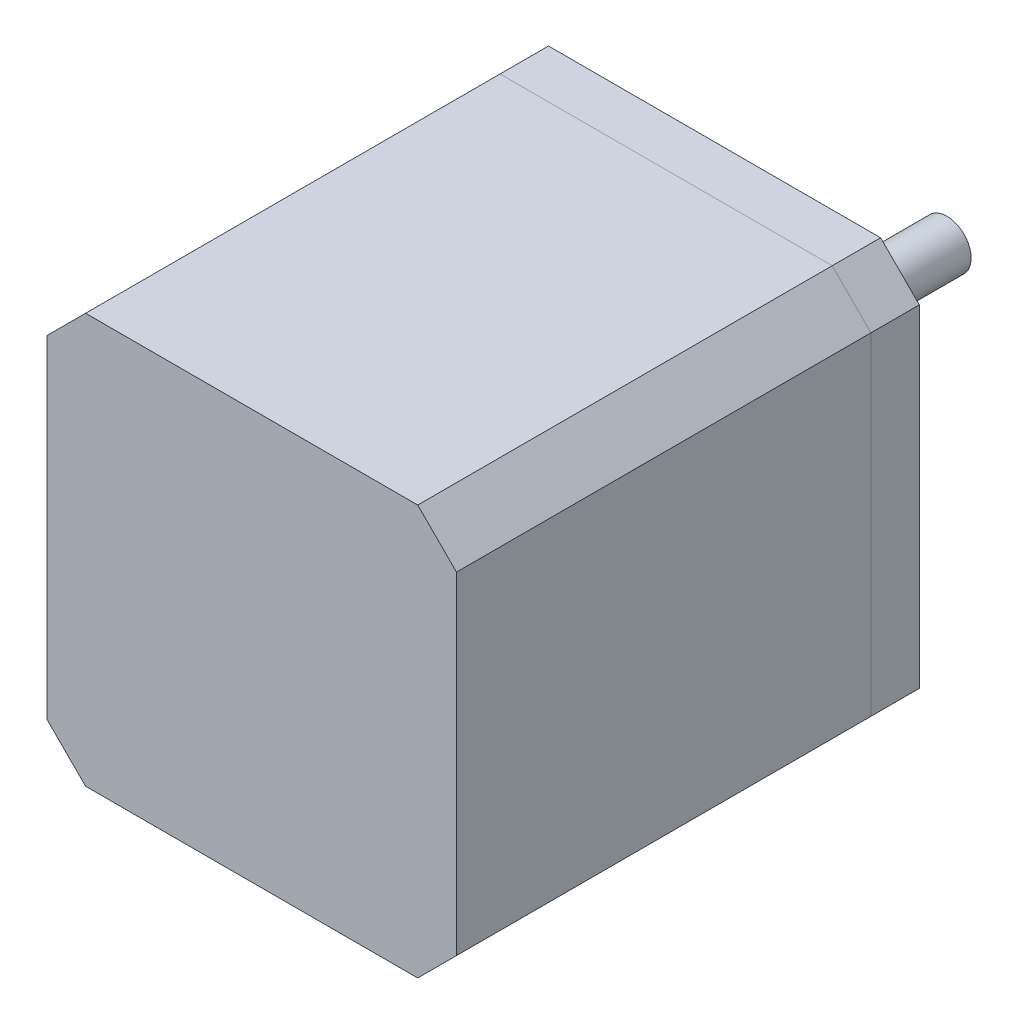
ISO-10303-21;
HEADER;
FILE_DESCRIPTION(('STEP AP214'),'2;1');
FILE_NAME('part.step','',(''),(''),'','','');
FILE_SCHEMA(('AUTOMOTIVE_DESIGN { 1 0 10303 214 1 1 1 1 }'));
ENDSEC;
DATA;
#1=APPLICATION_CONTEXT('core data for automotive mechanical design processes');
#2=APPLICATION_PROTOCOL_DEFINITION('international standard','automotive_design',2000,#1);
#3=PRODUCT_CONTEXT('',#1,'mechanical');
#4=PRODUCT('Part','Part','',(#3));
#5=PRODUCT_RELATED_PRODUCT_CATEGORY('part','',(#4));
#6=PRODUCT_DEFINITION_FORMATION('','',#4);
#7=PRODUCT_DEFINITION_CONTEXT('part definition',#1,'design');
#8=PRODUCT_DEFINITION('design','',#6,#7);
#9=PRODUCT_DEFINITION_SHAPE('','',#8);
#10=(LENGTH_UNIT() NAMED_UNIT(*) SI_UNIT(.MILLI.,.METRE.));
#11=(NAMED_UNIT(*) PLANE_ANGLE_UNIT() SI_UNIT($,.RADIAN.));
#12=(NAMED_UNIT(*) SI_UNIT($,.STERADIAN.) SOLID_ANGLE_UNIT());
#13=UNCERTAINTY_MEASURE_WITH_UNIT(LENGTH_MEASURE(1.E-05),#10,'distance_accuracy_value','');
#14=(GEOMETRIC_REPRESENTATION_CONTEXT(3) GLOBAL_UNCERTAINTY_ASSIGNED_CONTEXT((#13)) GLOBAL_UNIT_ASSIGNED_CONTEXT((#10,
#11,#12)) REPRESENTATION_CONTEXT('',''));
#15=CARTESIAN_POINT('',(0.,0.,0.));
#16=DIRECTION('',(0.,0.,1.));
#17=DIRECTION('',(1.,0.,0.));
#18=AXIS2_PLACEMENT_3D('',#15,#16,#17);
#19=CARTESIAN_POINT('',(0.,-38.3,42.8));
#20=DIRECTION('',(1.,0.,0.));
#21=DIRECTION('',(0.,1.,0.));
#22=AXIS2_PLACEMENT_3D('',#19,#20,#21);
#23=PLANE('',#22);
#24=DIRECTION('',(0.,-1.,0.));
#25=VECTOR('',#24,1.);
#26=CARTESIAN_POINT('',(0.,-38.3,0.));
#27=LINE('',#26,#25);
#28=CARTESIAN_POINT('',(0.,-4.00000000000002,0.));
#29=VERTEX_POINT('',#28);
#30=CARTESIAN_POINT('',(0.,-38.3,0.));
#31=VERTEX_POINT('',#30);
#32=EDGE_CURVE('E139',#29,#31,#27,.T.);
#33=ORIENTED_EDGE('',*,*,#32,.T.);
#34=DIRECTION('',(0.,0.,-1.));
#35=VECTOR('',#34,1.);
#36=CARTESIAN_POINT('',(0.,-38.3,42.8));
#37=LINE('',#36,#35);
#38=CARTESIAN_POINT('',(0.,-38.3,42.8));
#39=VERTEX_POINT('',#38);
#40=EDGE_CURVE('E12',#39,#31,#37,.T.);
#41=ORIENTED_EDGE('',*,*,#40,.F.);
#42=DIRECTION('',(0.,-1.,0.));
#43=VECTOR('',#42,1.);
#44=CARTESIAN_POINT('',(0.,-38.3,42.8));
#45=LINE('',#44,#43);
#46=CARTESIAN_POINT('',(0.,-4.00000000000002,42.8));
#47=VERTEX_POINT('',#46);
#48=EDGE_CURVE('E153',#47,#39,#45,.T.);
#49=ORIENTED_EDGE('',*,*,#48,.F.);
#50=DIRECTION('',(0.,0.,-1.));
#51=VECTOR('',#50,1.);
#52=CARTESIAN_POINT('',(0.,-4.00000000000002,42.8));
#53=LINE('',#52,#51);
#54=EDGE_CURVE('E135',#47,#29,#53,.T.);
#55=ORIENTED_EDGE('',*,*,#54,.T.);
#56=EDGE_LOOP('',(#33,#41,#49,#55));
#57=FACE_BOUND('',#56,.T.);
#58=ADVANCED_FACE('F43',(#57),#23,.F.);
#59=CARTESIAN_POINT('',(4.00000000000002,-42.3,42.8));
#60=DIRECTION('',(0.707106781186547,0.707106781186548,0.));
#61=DIRECTION('',(-0.707106781186548,0.707106781186547,0.));
#62=AXIS2_PLACEMENT_3D('',#59,#60,#61);
#63=PLANE('',#62);
#64=DIRECTION('',(0.707106781186548,-0.707106781186547,0.));
#65=VECTOR('',#64,1.);
#66=CARTESIAN_POINT('',(4.00000000000002,-42.3,0.));
#67=LINE('',#66,#65);
#68=CARTESIAN_POINT('',(4.00000000000002,-42.3,0.));
#69=VERTEX_POINT('',#68);
#70=EDGE_CURVE('E142',#31,#69,#67,.T.);
#71=ORIENTED_EDGE('',*,*,#70,.T.);
#72=DIRECTION('',(0.,0.,-1.));
#73=VECTOR('',#72,1.);
#74=CARTESIAN_POINT('',(4.00000000000002,-42.3,42.8));
#75=LINE('',#74,#73);
#76=CARTESIAN_POINT('',(4.00000000000002,-42.3,42.8));
#77=VERTEX_POINT('',#76);
#78=EDGE_CURVE('E51',#77,#69,#75,.T.);
#79=ORIENTED_EDGE('',*,*,#78,.F.);
#80=DIRECTION('',(0.707106781186548,-0.707106781186547,0.));
#81=VECTOR('',#80,1.);
#82=CARTESIAN_POINT('',(4.00000000000002,-42.3,42.8));
#83=LINE('',#82,#81);
#84=EDGE_CURVE('E102',#39,#77,#83,.T.);
#85=ORIENTED_EDGE('',*,*,#84,.F.);
#86=ORIENTED_EDGE('',*,*,#40,.T.);
#87=EDGE_LOOP('',(#71,#79,#85,#86));
#88=FACE_BOUND('',#87,.T.);
#89=ADVANCED_FACE('F188',(#88),#63,.F.);
#90=CARTESIAN_POINT('',(38.3,-42.3,42.8));
#91=DIRECTION('',(0.,1.,0.));
#92=DIRECTION('',(-1.,0.,0.));
#93=AXIS2_PLACEMENT_3D('',#90,#91,#92);
#94=PLANE('',#93);
#95=DIRECTION('',(1.,0.,0.));
#96=VECTOR('',#95,1.);
#97=CARTESIAN_POINT('',(38.3,-42.3,0.));
#98=LINE('',#97,#96);
#99=CARTESIAN_POINT('',(38.3,-42.3,0.));
#100=VERTEX_POINT('',#99);
#101=EDGE_CURVE('E144',#69,#100,#98,.T.);
#102=ORIENTED_EDGE('',*,*,#101,.T.);
#103=DIRECTION('',(0.,0.,-1.));
#104=VECTOR('',#103,1.);
#105=CARTESIAN_POINT('',(38.3,-42.3,42.8));
#106=LINE('',#105,#104);
#107=CARTESIAN_POINT('',(38.3,-42.3,42.8));
#108=VERTEX_POINT('',#107);
#109=EDGE_CURVE('E160',#108,#100,#106,.T.);
#110=ORIENTED_EDGE('',*,*,#109,.F.);
#111=DIRECTION('',(1.,0.,0.));
#112=VECTOR('',#111,1.);
#113=CARTESIAN_POINT('',(38.3,-42.3,42.8));
#114=LINE('',#113,#112);
#115=EDGE_CURVE('E168',#77,#108,#114,.T.);
#116=ORIENTED_EDGE('',*,*,#115,.F.);
#117=ORIENTED_EDGE('',*,*,#78,.T.);
#118=EDGE_LOOP('',(#102,#110,#116,#117));
#119=FACE_BOUND('',#118,.T.);
#120=ADVANCED_FACE('F166',(#119),#94,.F.);
#121=CARTESIAN_POINT('',(42.3,-38.3,42.8));
#122=DIRECTION('',(-0.707106781186549,0.707106781186546,0.));
#123=DIRECTION('',(-0.707106781186546,-0.707106781186549,0.));
#124=AXIS2_PLACEMENT_3D('',#121,#122,#123);
#125=PLANE('',#124);
#126=DIRECTION('',(0.707106781186546,0.707106781186549,0.));
#127=VECTOR('',#126,1.);
#128=CARTESIAN_POINT('',(42.3,-38.3,0.));
#129=LINE('',#128,#127);
#130=CARTESIAN_POINT('',(42.3,-38.3,0.));
#131=VERTEX_POINT('',#130);
#132=EDGE_CURVE('E146',#100,#131,#129,.T.);
#133=ORIENTED_EDGE('',*,*,#132,.T.);
#134=DIRECTION('',(0.,0.,-1.));
#135=VECTOR('',#134,1.);
#136=CARTESIAN_POINT('',(42.3,-38.3,42.8));
#137=LINE('',#136,#135);
#138=CARTESIAN_POINT('',(42.3,-38.3,42.8));
#139=VERTEX_POINT('',#138);
#140=EDGE_CURVE('E157',#139,#131,#137,.T.);
#141=ORIENTED_EDGE('',*,*,#140,.F.);
#142=DIRECTION('',(0.707106781186546,0.707106781186549,0.));
#143=VECTOR('',#142,1.);
#144=CARTESIAN_POINT('',(42.3,-38.3,42.8));
#145=LINE('',#144,#143);
#146=EDGE_CURVE('E180',#108,#139,#145,.T.);
#147=ORIENTED_EDGE('',*,*,#146,.F.);
#148=ORIENTED_EDGE('',*,*,#109,.T.);
#149=EDGE_LOOP('',(#133,#141,#147,#148));
#150=FACE_BOUND('',#149,.T.);
#151=ADVANCED_FACE('F176',(#150),#125,.F.);
#152=CARTESIAN_POINT('',(42.3,-4.,42.8));
#153=DIRECTION('',(-1.,0.,0.));
#154=DIRECTION('',(0.,0.,1.));
#155=AXIS2_PLACEMENT_3D('',#152,#153,#154);
#156=PLANE('',#155);
#157=DIRECTION('',(0.,1.,0.));
#158=VECTOR('',#157,1.);
#159=CARTESIAN_POINT('',(42.3,-4.,0.));
#160=LINE('',#159,#158);
#161=CARTESIAN_POINT('',(42.3,-4.,0.));
#162=VERTEX_POINT('',#161);
#163=EDGE_CURVE('E148',#131,#162,#160,.T.);
#164=ORIENTED_EDGE('',*,*,#163,.T.);
#165=DIRECTION('',(0.,0.,-1.));
#166=VECTOR('',#165,1.);
#167=CARTESIAN_POINT('',(42.3,-4.,42.8));
#168=LINE('',#167,#166);
#169=CARTESIAN_POINT('',(42.3,-4.,42.8));
#170=VERTEX_POINT('',#169);
#171=EDGE_CURVE('E130',#170,#162,#168,.T.);
#172=ORIENTED_EDGE('',*,*,#171,.F.);
#173=DIRECTION('',(0.,1.,0.));
#174=VECTOR('',#173,1.);
#175=CARTESIAN_POINT('',(42.3,-4.,42.8));
#176=LINE('',#175,#174);
#177=EDGE_CURVE('E121',#139,#170,#176,.T.);
#178=ORIENTED_EDGE('',*,*,#177,.F.);
#179=ORIENTED_EDGE('',*,*,#140,.T.);
#180=EDGE_LOOP('',(#164,#172,#178,#179));
#181=FACE_BOUND('',#180,.T.);
#182=ADVANCED_FACE('F179',(#181),#156,.F.);
#183=CARTESIAN_POINT('',(38.3,0.,42.8));
#184=DIRECTION('',(-0.707106781186546,-0.707106781186549,0.));
#185=DIRECTION('',(0.707106781186549,-0.707106781186546,0.));
#186=AXIS2_PLACEMENT_3D('',#183,#184,#185);
#187=PLANE('',#186);
#188=DIRECTION('',(-0.707106781186549,0.707106781186546,0.));
#189=VECTOR('',#188,1.);
#190=CARTESIAN_POINT('',(38.3,0.,0.));
#191=LINE('',#190,#189);
#192=CARTESIAN_POINT('',(38.3,0.,0.));
#193=VERTEX_POINT('',#192);
#194=EDGE_CURVE('E129',#162,#193,#191,.T.);
#195=ORIENTED_EDGE('',*,*,#194,.T.);
#196=DIRECTION('',(0.,0.,-1.));
#197=VECTOR('',#196,1.);
#198=CARTESIAN_POINT('',(38.3,0.,42.8));
#199=LINE('',#198,#197);
#200=CARTESIAN_POINT('',(38.3,0.,42.8));
#201=VERTEX_POINT('',#200);
#202=EDGE_CURVE('E126',#201,#193,#199,.T.);
#203=ORIENTED_EDGE('',*,*,#202,.F.);
#204=DIRECTION('',(-0.707106781186549,0.707106781186546,0.));
#205=VECTOR('',#204,1.);
#206=CARTESIAN_POINT('',(38.3,0.,42.8));
#207=LINE('',#206,#205);
#208=EDGE_CURVE('E115',#170,#201,#207,.T.);
#209=ORIENTED_EDGE('',*,*,#208,.F.);
#210=ORIENTED_EDGE('',*,*,#171,.T.);
#211=EDGE_LOOP('',(#195,#203,#209,#210));
#212=FACE_BOUND('',#211,.T.);
#213=ADVANCED_FACE('F127',(#212),#187,.F.);
#214=CARTESIAN_POINT('',(4.,0.,42.8));
#215=DIRECTION('',(0.,-1.,0.));
#216=DIRECTION('',(0.,0.,-1.));
#217=AXIS2_PLACEMENT_3D('',#214,#215,#216);
#218=PLANE('',#217);
#219=DIRECTION('',(-1.,0.,0.));
#220=VECTOR('',#219,1.);
#221=CARTESIAN_POINT('',(4.,0.,0.));
#222=LINE('',#221,#220);
#223=CARTESIAN_POINT('',(4.,0.,0.));
#224=VERTEX_POINT('',#223);
#225=EDGE_CURVE('E88',#193,#224,#222,.T.);
#226=ORIENTED_EDGE('',*,*,#225,.T.);
#227=DIRECTION('',(0.,0.,-1.));
#228=VECTOR('',#227,1.);
#229=CARTESIAN_POINT('',(4.,0.,42.8));
#230=LINE('',#229,#228);
#231=CARTESIAN_POINT('',(4.,0.,42.8));
#232=VERTEX_POINT('',#231);
#233=EDGE_CURVE('E131',#232,#224,#230,.T.);
#234=ORIENTED_EDGE('',*,*,#233,.F.);
#235=DIRECTION('',(-1.,0.,0.));
#236=VECTOR('',#235,1.);
#237=CARTESIAN_POINT('',(4.,0.,42.8));
#238=LINE('',#237,#236);
#239=EDGE_CURVE('E119',#201,#232,#238,.T.);
#240=ORIENTED_EDGE('',*,*,#239,.F.);
#241=ORIENTED_EDGE('',*,*,#202,.T.);
#242=EDGE_LOOP('',(#226,#234,#240,#241));
#243=FACE_BOUND('',#242,.T.);
#244=ADVANCED_FACE('F133',(#243),#218,.F.);
#245=CARTESIAN_POINT('',(0.,-4.00000000000002,42.8));
#246=DIRECTION('',(0.707106781186549,-0.707106781186546,0.));
#247=DIRECTION('',(0.707106781186546,0.707106781186549,0.));
#248=AXIS2_PLACEMENT_3D('',#245,#246,#247);
#249=PLANE('',#248);
#250=DIRECTION('',(-0.707106781186546,-0.707106781186549,0.));
#251=VECTOR('',#250,1.);
#252=CARTESIAN_POINT('',(0.,-4.00000000000002,0.));
#253=LINE('',#252,#251);
#254=EDGE_CURVE('E94',#224,#29,#253,.T.);
#255=ORIENTED_EDGE('',*,*,#254,.T.);
#256=ORIENTED_EDGE('',*,*,#54,.F.);
#257=DIRECTION('',(-0.707106781186546,-0.707106781186549,0.));
#258=VECTOR('',#257,1.);
#259=CARTESIAN_POINT('',(0.,-4.00000000000002,42.8));
#260=LINE('',#259,#258);
#261=EDGE_CURVE('E59',#232,#47,#260,.T.);
#262=ORIENTED_EDGE('',*,*,#261,.F.);
#263=ORIENTED_EDGE('',*,*,#233,.T.);
#264=EDGE_LOOP('',(#255,#256,#262,#263));
#265=FACE_BOUND('',#264,.T.);
#266=ADVANCED_FACE('F204',(#265),#249,.F.);
#267=CARTESIAN_POINT('',(0.,0.,42.8));
#268=DIRECTION('',(0.,0.,-1.));
#269=DIRECTION('',(-1.,0.,0.));
#270=AXIS2_PLACEMENT_3D('',#267,#268,#269);
#271=PLANE('',#270);
#272=ORIENTED_EDGE('',*,*,#48,.T.);
#273=ORIENTED_EDGE('',*,*,#84,.T.);
#274=ORIENTED_EDGE('',*,*,#115,.T.);
#275=ORIENTED_EDGE('',*,*,#146,.T.);
#276=ORIENTED_EDGE('',*,*,#177,.T.);
#277=ORIENTED_EDGE('',*,*,#208,.T.);
#278=ORIENTED_EDGE('',*,*,#239,.T.);
#279=ORIENTED_EDGE('',*,*,#261,.T.);
#280=EDGE_LOOP('',(#272,#273,#274,#275,#276,#277,#278,#279));
#281=FACE_BOUND('',#280,.T.);
#282=ADVANCED_FACE('F117',(#281),#271,.F.);
#283=CARTESIAN_POINT('',(0.,0.,0.));
#284=DIRECTION('',(0.,0.,-1.));
#285=DIRECTION('',(-1.,0.,0.));
#286=AXIS2_PLACEMENT_3D('',#283,#284,#285);
#287=PLANE('',#286);
#288=ORIENTED_EDGE('',*,*,#32,.F.);
#289=ORIENTED_EDGE('',*,*,#254,.F.);
#290=ORIENTED_EDGE('',*,*,#225,.F.);
#291=ORIENTED_EDGE('',*,*,#194,.F.);
#292=ORIENTED_EDGE('',*,*,#163,.F.);
#293=ORIENTED_EDGE('',*,*,#132,.F.);
#294=ORIENTED_EDGE('',*,*,#101,.F.);
#295=ORIENTED_EDGE('',*,*,#70,.F.);
#296=EDGE_LOOP('',(#288,#289,#290,#291,#292,#293,#294,#295));
#297=FACE_BOUND('',#296,.T.);
#298=ADVANCED_FACE('F172',(#297),#287,.T.);
#299=CLOSED_SHELL('',(#58,#89,#120,#151,#182,#213,#244,#266,#282,#298));
#300=MANIFOLD_SOLID_BREP('B2',#299);
#301=CARTESIAN_POINT('',(21.15,-21.15,-7.));
#302=DIRECTION('',(0.,0.,-1.));
#303=DIRECTION('',(0.,1.,0.));
#304=AXIS2_PLACEMENT_3D('',#301,#302,#303);
#305=PLANE('',#304);
#306=CARTESIAN_POINT('',(21.15,-21.15,-7.));
#307=DIRECTION('',(0.,0.,-1.));
#308=DIRECTION('',(0.,1.,0.));
#309=AXIS2_PLACEMENT_3D('',#306,#307,#308);
#310=CIRCLE('',#309,11.);
#311=CARTESIAN_POINT('',(21.15,-10.15,-7.));
#312=VERTEX_POINT('',#311);
#313=EDGE_CURVE('E372',#312,#312,#310,.T.);
#314=ORIENTED_EDGE('',*,*,#313,.T.);
#315=EDGE_LOOP('',(#314));
#316=FACE_BOUND('',#315,.T.);
#317=CARTESIAN_POINT('',(21.15,-21.15,-7.));
#318=DIRECTION('',(0.,0.,-1.));
#319=DIRECTION('',(0.,1.,0.));
#320=AXIS2_PLACEMENT_3D('',#317,#318,#319);
#321=CIRCLE('',#320,2.5);
#322=CARTESIAN_POINT('',(21.15,-18.65,-7.));
#323=VERTEX_POINT('',#322);
#324=EDGE_CURVE('E367',#323,#323,#321,.T.);
#325=ORIENTED_EDGE('',*,*,#324,.F.);
#326=EDGE_LOOP('',(#325));
#327=FACE_BOUND('',#326,.T.);
#328=ADVANCED_FACE('F271',(#316,#327),#305,.T.);
#329=CARTESIAN_POINT('',(0.,-42.3,-5.));
#330=DIRECTION('',(0.,0.,1.));
#331=DIRECTION('',(1.,0.,0.));
#332=AXIS2_PLACEMENT_3D('',#329,#330,#331);
#333=PLANE('',#332);
#334=CARTESIAN_POINT('',(36.8,-36.8,-5.));
#335=DIRECTION('',(0.,0.,-1.));
#336=DIRECTION('',(1.,0.,0.));
#337=AXIS2_PLACEMENT_3D('',#334,#335,#336);
#338=CIRCLE('',#337,1.25);
#339=CARTESIAN_POINT('',(38.05,-36.8,-5.));
#340=VERTEX_POINT('',#339);
#341=EDGE_CURVE('E655',#340,#340,#338,.T.);
#342=ORIENTED_EDGE('',*,*,#341,.F.);
#343=EDGE_LOOP('',(#342));
#344=FACE_BOUND('',#343,.T.);
#345=CARTESIAN_POINT('',(5.49999999999999,-36.8,-5.));
#346=DIRECTION('',(0.,0.,-1.));
#347=DIRECTION('',(-1.,0.,0.));
#348=AXIS2_PLACEMENT_3D('',#345,#346,#347);
#349=CIRCLE('',#348,1.24999999999999);
#350=CARTESIAN_POINT('',(4.25,-36.8,-5.));
#351=VERTEX_POINT('',#350);
#352=EDGE_CURVE('E654',#351,#351,#349,.T.);
#353=ORIENTED_EDGE('',*,*,#352,.F.);
#354=EDGE_LOOP('',(#353));
#355=FACE_BOUND('',#354,.T.);
#356=CARTESIAN_POINT('',(5.49999999999998,-5.50000000000001,-5.));
#357=DIRECTION('',(0.,0.,-1.));
#358=DIRECTION('',(1.,0.,0.));
#359=AXIS2_PLACEMENT_3D('',#356,#357,#358);
#360=CIRCLE('',#359,1.24999999999999);
#361=CARTESIAN_POINT('',(6.74999999999997,-5.50000000000001,-5.));
#362=VERTEX_POINT('',#361);
#363=EDGE_CURVE('E664',#362,#362,#360,.T.);
#364=ORIENTED_EDGE('',*,*,#363,.F.);
#365=EDGE_LOOP('',(#364));
#366=FACE_BOUND('',#365,.T.);
#367=CARTESIAN_POINT('',(36.8,-5.5,-5.));
#368=DIRECTION('',(0.,0.,-1.));
#369=DIRECTION('',(-1.,0.,0.));
#370=AXIS2_PLACEMENT_3D('',#367,#368,#369);
#371=CIRCLE('',#370,1.25);
#372=CARTESIAN_POINT('',(35.55,-5.5,-5.));
#373=VERTEX_POINT('',#372);
#374=EDGE_CURVE('E669',#373,#373,#371,.T.);
#375=ORIENTED_EDGE('',*,*,#374,.F.);
#376=EDGE_LOOP('',(#375));
#377=FACE_BOUND('',#376,.T.);
#378=DIRECTION('',(0.,1.,0.));
#379=VECTOR('',#378,1.);
#380=CARTESIAN_POINT('',(0.,0.,-5.));
#381=LINE('',#380,#379);
#382=CARTESIAN_POINT('',(0.,-38.3,-5.));
#383=VERTEX_POINT('',#382);
#384=CARTESIAN_POINT('',(0.,-4.00000000000002,-5.));
#385=VERTEX_POINT('',#384);
#386=EDGE_CURVE('E378',#383,#385,#381,.T.);
#387=ORIENTED_EDGE('',*,*,#386,.T.);
#388=DIRECTION('',(-0.707106781186546,-0.707106781186549,0.));
#389=VECTOR('',#388,1.);
#390=CARTESIAN_POINT('',(4.,0.,-5.));
#391=LINE('',#390,#389);
#392=CARTESIAN_POINT('',(4.,0.,-5.));
#393=VERTEX_POINT('',#392);
#394=EDGE_CURVE('E423',#385,#393,#391,.F.);
#395=ORIENTED_EDGE('',*,*,#394,.T.);
#396=DIRECTION('',(1.,0.,0.));
#397=VECTOR('',#396,1.);
#398=CARTESIAN_POINT('',(0.,0.,-5.));
#399=LINE('',#398,#397);
#400=CARTESIAN_POINT('',(38.3,0.,-5.));
#401=VERTEX_POINT('',#400);
#402=EDGE_CURVE('E381',#393,#401,#399,.T.);
#403=ORIENTED_EDGE('',*,*,#402,.T.);
#404=DIRECTION('',(-0.707106781186549,0.707106781186546,0.));
#405=VECTOR('',#404,1.);
#406=CARTESIAN_POINT('',(42.3,-4.,-5.));
#407=LINE('',#406,#405);
#408=CARTESIAN_POINT('',(42.3,-4.,-5.));
#409=VERTEX_POINT('',#408);
#410=EDGE_CURVE('E421',#401,#409,#407,.F.);
#411=ORIENTED_EDGE('',*,*,#410,.T.);
#412=DIRECTION('',(0.,-1.,0.));
#413=VECTOR('',#412,1.);
#414=CARTESIAN_POINT('',(42.3,0.,-5.));
#415=LINE('',#414,#413);
#416=CARTESIAN_POINT('',(42.3,-38.3,-5.));
#417=VERTEX_POINT('',#416);
#418=EDGE_CURVE('E385',#409,#417,#415,.T.);
#419=ORIENTED_EDGE('',*,*,#418,.T.);
#420=DIRECTION('',(0.707106781186546,0.707106781186549,0.));
#421=VECTOR('',#420,1.);
#422=CARTESIAN_POINT('',(38.3,-42.3,-5.));
#423=LINE('',#422,#421);
#424=CARTESIAN_POINT('',(38.3,-42.3,-5.));
#425=VERTEX_POINT('',#424);
#426=EDGE_CURVE('E419',#417,#425,#423,.F.);
#427=ORIENTED_EDGE('',*,*,#426,.T.);
#428=DIRECTION('',(-1.,0.,0.));
#429=VECTOR('',#428,1.);
#430=CARTESIAN_POINT('',(0.,-42.3,-5.));
#431=LINE('',#430,#429);
#432=CARTESIAN_POINT('',(4.00000000000002,-42.3,-5.));
#433=VERTEX_POINT('',#432);
#434=EDGE_CURVE('E388',#425,#433,#431,.T.);
#435=ORIENTED_EDGE('',*,*,#434,.T.);
#436=DIRECTION('',(0.707106781186549,-0.707106781186546,0.));
#437=VECTOR('',#436,1.);
#438=CARTESIAN_POINT('',(0.,-38.3,-5.));
#439=LINE('',#438,#437);
#440=EDGE_CURVE('E417',#433,#383,#439,.F.);
#441=ORIENTED_EDGE('',*,*,#440,.T.);
#442=EDGE_LOOP('',(#387,#395,#403,#411,#419,#427,#435,#441));
#443=FACE_BOUND('',#442,.T.);
#444=CARTESIAN_POINT('',(21.15,-21.15,-5.));
#445=DIRECTION('',(0.,0.,1.));
#446=DIRECTION('',(1.,0.,0.));
#447=AXIS2_PLACEMENT_3D('',#444,#445,#446);
#448=CIRCLE('',#447,11.);
#449=CARTESIAN_POINT('',(32.15,-21.15,-5.));
#450=VERTEX_POINT('',#449);
#451=EDGE_CURVE('E41',#450,#450,#448,.F.);
#452=ORIENTED_EDGE('',*,*,#451,.F.);
#453=EDGE_LOOP('',(#452));
#454=FACE_BOUND('',#453,.T.);
#455=ADVANCED_FACE('F450',(#344,#355,#366,#377,#443,#454),#333,.F.);
#456=CARTESIAN_POINT('',(0.,0.,-5.));
#457=DIRECTION('',(1.,0.,0.));
#458=DIRECTION('',(0.,0.,-1.));
#459=AXIS2_PLACEMENT_3D('',#456,#457,#458);
#460=PLANE('',#459);
#461=DIRECTION('',(0.,1.,0.));
#462=VECTOR('',#461,1.);
#463=CARTESIAN_POINT('',(0.,0.,0.));
#464=LINE('',#463,#462);
#465=CARTESIAN_POINT('',(0.,-38.3,0.));
#466=VERTEX_POINT('',#465);
#467=CARTESIAN_POINT('',(0.,-4.00000000000002,0.));
#468=VERTEX_POINT('',#467);
#469=EDGE_CURVE('E377',#466,#468,#464,.T.);
#470=ORIENTED_EDGE('',*,*,#469,.T.);
#471=DIRECTION('',(0.,0.,-1.));
#472=VECTOR('',#471,1.);
#473=CARTESIAN_POINT('',(0.,-4.00000000000002,-5.));
#474=LINE('',#473,#472);
#475=EDGE_CURVE('E415',#468,#385,#474,.T.);
#476=ORIENTED_EDGE('',*,*,#475,.T.);
#477=ORIENTED_EDGE('',*,*,#386,.F.);
#478=DIRECTION('',(0.,0.,1.));
#479=VECTOR('',#478,1.);
#480=CARTESIAN_POINT('',(0.,-38.3,-5.));
#481=LINE('',#480,#479);
#482=EDGE_CURVE('E412',#383,#466,#481,.T.);
#483=ORIENTED_EDGE('',*,*,#482,.T.);
#484=EDGE_LOOP('',(#470,#476,#477,#483));
#485=FACE_BOUND('',#484,.T.);
#486=ADVANCED_FACE('F446',(#485),#460,.F.);
#487=CARTESIAN_POINT('',(0.,0.,-5.));
#488=DIRECTION('',(0.,-1.,0.));
#489=DIRECTION('',(0.,0.,-1.));
#490=AXIS2_PLACEMENT_3D('',#487,#488,#489);
#491=PLANE('',#490);
#492=ORIENTED_EDGE('',*,*,#402,.F.);
#493=DIRECTION('',(0.,0.,1.));
#494=VECTOR('',#493,1.);
#495=CARTESIAN_POINT('',(4.,0.,-5.));
#496=LINE('',#495,#494);
#497=CARTESIAN_POINT('',(4.,0.,0.));
#498=VERTEX_POINT('',#497);
#499=EDGE_CURVE('E401',#393,#498,#496,.T.);
#500=ORIENTED_EDGE('',*,*,#499,.T.);
#501=DIRECTION('',(1.,0.,0.));
#502=VECTOR('',#501,1.);
#503=CARTESIAN_POINT('',(0.,0.,0.));
#504=LINE('',#503,#502);
#505=CARTESIAN_POINT('',(38.3,0.,0.));
#506=VERTEX_POINT('',#505);
#507=EDGE_CURVE('E393',#498,#506,#504,.T.);
#508=ORIENTED_EDGE('',*,*,#507,.T.);
#509=DIRECTION('',(0.,0.,-1.));
#510=VECTOR('',#509,1.);
#511=CARTESIAN_POINT('',(38.3,0.,-5.));
#512=LINE('',#511,#510);
#513=EDGE_CURVE('E390',#506,#401,#512,.T.);
#514=ORIENTED_EDGE('',*,*,#513,.T.);
#515=EDGE_LOOP('',(#492,#500,#508,#514));
#516=FACE_BOUND('',#515,.T.);
#517=ADVANCED_FACE('F457',(#516),#491,.F.);
#518=CARTESIAN_POINT('',(42.3,0.,-5.));
#519=DIRECTION('',(-1.,0.,0.));
#520=DIRECTION('',(0.,0.,1.));
#521=AXIS2_PLACEMENT_3D('',#518,#519,#520);
#522=PLANE('',#521);
#523=ORIENTED_EDGE('',*,*,#418,.F.);
#524=DIRECTION('',(0.,0.,1.));
#525=VECTOR('',#524,1.);
#526=CARTESIAN_POINT('',(42.3,-4.,-5.));
#527=LINE('',#526,#525);
#528=CARTESIAN_POINT('',(42.3,-4.,0.));
#529=VERTEX_POINT('',#528);
#530=EDGE_CURVE('E427',#409,#529,#527,.T.);
#531=ORIENTED_EDGE('',*,*,#530,.T.);
#532=DIRECTION('',(0.,-1.,0.));
#533=VECTOR('',#532,1.);
#534=CARTESIAN_POINT('',(42.3,0.,0.));
#535=LINE('',#534,#533);
#536=CARTESIAN_POINT('',(42.3,-38.3,0.));
#537=VERTEX_POINT('',#536);
#538=EDGE_CURVE('E396',#529,#537,#535,.T.);
#539=ORIENTED_EDGE('',*,*,#538,.T.);
#540=DIRECTION('',(0.,0.,-1.));
#541=VECTOR('',#540,1.);
#542=CARTESIAN_POINT('',(42.3,-38.3,-5.));
#543=LINE('',#542,#541);
#544=EDGE_CURVE('E425',#537,#417,#543,.T.);
#545=ORIENTED_EDGE('',*,*,#544,.T.);
#546=EDGE_LOOP('',(#523,#531,#539,#545));
#547=FACE_BOUND('',#546,.T.);
#548=ADVANCED_FACE('F465',(#547),#522,.F.);
#549=CARTESIAN_POINT('',(0.,-42.3,-5.));
#550=DIRECTION('',(0.,1.,0.));
#551=DIRECTION('',(0.,0.,1.));
#552=AXIS2_PLACEMENT_3D('',#549,#550,#551);
#553=PLANE('',#552);
#554=ORIENTED_EDGE('',*,*,#434,.F.);
#555=DIRECTION('',(0.,0.,1.));
#556=VECTOR('',#555,1.);
#557=CARTESIAN_POINT('',(38.3,-42.3,-5.));
#558=LINE('',#557,#556);
#559=CARTESIAN_POINT('',(38.3,-42.3,0.));
#560=VERTEX_POINT('',#559);
#561=EDGE_CURVE('E279',#425,#560,#558,.T.);
#562=ORIENTED_EDGE('',*,*,#561,.T.);
#563=DIRECTION('',(-1.,0.,0.));
#564=VECTOR('',#563,1.);
#565=CARTESIAN_POINT('',(0.,-42.3,0.));
#566=LINE('',#565,#564);
#567=CARTESIAN_POINT('',(4.00000000000002,-42.3,0.));
#568=VERTEX_POINT('',#567);
#569=EDGE_CURVE('E382',#560,#568,#566,.T.);
#570=ORIENTED_EDGE('',*,*,#569,.T.);
#571=DIRECTION('',(0.,0.,-1.));
#572=VECTOR('',#571,1.);
#573=CARTESIAN_POINT('',(4.00000000000002,-42.3,-5.));
#574=LINE('',#573,#572);
#575=EDGE_CURVE('E294',#568,#433,#574,.T.);
#576=ORIENTED_EDGE('',*,*,#575,.T.);
#577=EDGE_LOOP('',(#554,#562,#570,#576));
#578=FACE_BOUND('',#577,.T.);
#579=ADVANCED_FACE('F433',(#578),#553,.F.);
#580=CARTESIAN_POINT('',(0.,-42.3,0.));
#581=DIRECTION('',(0.,0.,1.));
#582=DIRECTION('',(1.,0.,0.));
#583=AXIS2_PLACEMENT_3D('',#580,#581,#582);
#584=PLANE('',#583);
#585=ORIENTED_EDGE('',*,*,#507,.F.);
#586=DIRECTION('',(0.707106781186546,0.707106781186549,0.));
#587=VECTOR('',#586,1.);
#588=CARTESIAN_POINT('',(-19.15,-23.1500000000001,0.));
#589=LINE('',#588,#587);
#590=EDGE_CURVE('E410',#498,#468,#589,.F.);
#591=ORIENTED_EDGE('',*,*,#590,.T.);
#592=ORIENTED_EDGE('',*,*,#469,.F.);
#593=DIRECTION('',(-0.707106781186549,0.707106781186546,0.));
#594=VECTOR('',#593,1.);
#595=CARTESIAN_POINT('',(2.,-40.3,0.));
#596=LINE('',#595,#594);
#597=EDGE_CURVE('E404',#466,#568,#596,.F.);
#598=ORIENTED_EDGE('',*,*,#597,.T.);
#599=ORIENTED_EDGE('',*,*,#569,.F.);
#600=DIRECTION('',(-0.707106781186546,-0.707106781186549,0.));
#601=VECTOR('',#600,1.);
#602=CARTESIAN_POINT('',(19.1500000000001,-61.45,0.));
#603=LINE('',#602,#601);
#604=EDGE_CURVE('E406',#560,#537,#603,.F.);
#605=ORIENTED_EDGE('',*,*,#604,.T.);
#606=ORIENTED_EDGE('',*,*,#538,.F.);
#607=DIRECTION('',(0.707106781186549,-0.707106781186546,0.));
#608=VECTOR('',#607,1.);
#609=CARTESIAN_POINT('',(40.2999999999999,-1.99999999999993,0.));
#610=LINE('',#609,#608);
#611=EDGE_CURVE('E408',#529,#506,#610,.F.);
#612=ORIENTED_EDGE('',*,*,#611,.T.);
#613=EDGE_LOOP('',(#585,#591,#592,#598,#599,#605,#606,#612));
#614=FACE_BOUND('',#613,.T.);
#615=ADVANCED_FACE('F438',(#614),#584,.T.);
#616=CARTESIAN_POINT('',(4.,0.,-5.));
#617=DIRECTION('',(0.707106781186549,-0.707106781186546,0.));
#618=DIRECTION('',(0.707106781186546,0.707106781186549,0.));
#619=AXIS2_PLACEMENT_3D('',#616,#617,#618);
#620=PLANE('',#619);
#621=ORIENTED_EDGE('',*,*,#394,.F.);
#622=ORIENTED_EDGE('',*,*,#475,.F.);
#623=ORIENTED_EDGE('',*,*,#590,.F.);
#624=ORIENTED_EDGE('',*,*,#499,.F.);
#625=EDGE_LOOP('',(#621,#622,#623,#624));
#626=FACE_BOUND('',#625,.T.);
#627=ADVANCED_FACE('F455',(#626),#620,.F.);
#628=CARTESIAN_POINT('',(42.3,-4.,-5.));
#629=DIRECTION('',(-0.707106781186546,-0.707106781186549,0.));
#630=DIRECTION('',(0.707106781186549,-0.707106781186546,0.));
#631=AXIS2_PLACEMENT_3D('',#628,#629,#630);
#632=PLANE('',#631);
#633=ORIENTED_EDGE('',*,*,#410,.F.);
#634=ORIENTED_EDGE('',*,*,#513,.F.);
#635=ORIENTED_EDGE('',*,*,#611,.F.);
#636=ORIENTED_EDGE('',*,*,#530,.F.);
#637=EDGE_LOOP('',(#633,#634,#635,#636));
#638=FACE_BOUND('',#637,.T.);
#639=ADVANCED_FACE('F462',(#638),#632,.F.);
#640=CARTESIAN_POINT('',(38.3,-42.3,-5.));
#641=DIRECTION('',(-0.707106781186549,0.707106781186546,0.));
#642=DIRECTION('',(-0.707106781186546,-0.707106781186549,0.));
#643=AXIS2_PLACEMENT_3D('',#640,#641,#642);
#644=PLANE('',#643);
#645=ORIENTED_EDGE('',*,*,#426,.F.);
#646=ORIENTED_EDGE('',*,*,#544,.F.);
#647=ORIENTED_EDGE('',*,*,#604,.F.);
#648=ORIENTED_EDGE('',*,*,#561,.F.);
#649=EDGE_LOOP('',(#645,#646,#647,#648));
#650=FACE_BOUND('',#649,.T.);
#651=ADVANCED_FACE('F467',(#650),#644,.F.);
#652=CARTESIAN_POINT('',(0.,-38.3,-5.));
#653=DIRECTION('',(0.707106781186546,0.707106781186549,0.));
#654=DIRECTION('',(-0.707106781186549,0.707106781186546,0.));
#655=AXIS2_PLACEMENT_3D('',#652,#653,#654);
#656=PLANE('',#655);
#657=ORIENTED_EDGE('',*,*,#440,.F.);
#658=ORIENTED_EDGE('',*,*,#575,.F.);
#659=ORIENTED_EDGE('',*,*,#597,.F.);
#660=ORIENTED_EDGE('',*,*,#482,.F.);
#661=EDGE_LOOP('',(#657,#658,#659,#660));
#662=FACE_BOUND('',#661,.T.);
#663=ADVANCED_FACE('F273',(#662),#656,.F.);
#664=CARTESIAN_POINT('',(21.15,-21.15,-7.));
#665=DIRECTION('',(0.,0.,1.));
#666=DIRECTION('',(0.,-1.,0.));
#667=AXIS2_PLACEMENT_3D('',#664,#665,#666);
#668=CYLINDRICAL_SURFACE('',#667,11.);
#669=ORIENTED_EDGE('',*,*,#313,.F.);
#670=EDGE_LOOP('',(#669));
#671=FACE_BOUND('',#670,.T.);
#672=ORIENTED_EDGE('',*,*,#451,.T.);
#673=EDGE_LOOP('',(#672));
#674=FACE_BOUND('',#673,.T.);
#675=ADVANCED_FACE('F473',(#671,#674),#668,.T.);
#676=CARTESIAN_POINT('',(21.15,-21.15,-29.));
#677=DIRECTION('',(0.,0.,1.));
#678=DIRECTION('',(0.,-1.,0.));
#679=AXIS2_PLACEMENT_3D('',#676,#677,#678);
#680=CYLINDRICAL_SURFACE('',#679,2.5);
#681=CARTESIAN_POINT('',(21.15,-21.15,-29.));
#682=DIRECTION('',(0.,0.,-1.));
#683=DIRECTION('',(0.,1.,0.));
#684=AXIS2_PLACEMENT_3D('',#681,#682,#683);
#685=CIRCLE('',#684,2.5);
#686=CARTESIAN_POINT('',(19.15,-19.65,-29.));
#687=VERTEX_POINT('',#686);
#688=CARTESIAN_POINT('',(19.15,-22.65,-29.));
#689=VERTEX_POINT('',#688);
#690=EDGE_CURVE('E365',#687,#689,#685,.T.);
#691=ORIENTED_EDGE('',*,*,#690,.F.);
#692=DIRECTION('',(0.,0.,-1.));
#693=VECTOR('',#692,1.);
#694=CARTESIAN_POINT('',(19.15,-19.65,-14.));
#695=LINE('',#694,#693);
#696=CARTESIAN_POINT('',(19.15,-19.65,-14.));
#697=VERTEX_POINT('',#696);
#698=EDGE_CURVE('E286',#697,#687,#695,.T.);
#699=ORIENTED_EDGE('',*,*,#698,.F.);
#700=CARTESIAN_POINT('',(21.15,-21.15,-14.));
#701=DIRECTION('',(0.,0.,-1.));
#702=DIRECTION('',(0.,1.,0.));
#703=AXIS2_PLACEMENT_3D('',#700,#701,#702);
#704=CIRCLE('',#703,2.5);
#705=CARTESIAN_POINT('',(19.15,-22.65,-14.));
#706=VERTEX_POINT('',#705);
#707=EDGE_CURVE('E351',#706,#697,#704,.T.);
#708=ORIENTED_EDGE('',*,*,#707,.F.);
#709=DIRECTION('',(0.,0.,-1.));
#710=VECTOR('',#709,1.);
#711=CARTESIAN_POINT('',(19.15,-22.65,-14.));
#712=LINE('',#711,#710);
#713=EDGE_CURVE('E359',#706,#689,#712,.T.);
#714=ORIENTED_EDGE('',*,*,#713,.T.);
#715=EDGE_LOOP('',(#691,#699,#708,#714));
#716=FACE_BOUND('',#715,.T.);
#717=ORIENTED_EDGE('',*,*,#324,.T.);
#718=EDGE_LOOP('',(#717));
#719=FACE_BOUND('',#718,.T.);
#720=ADVANCED_FACE('F362',(#716,#719),#680,.T.);
#721=CARTESIAN_POINT('',(21.15,-21.15,-29.));
#722=DIRECTION('',(0.,0.,-1.));
#723=DIRECTION('',(0.,1.,0.));
#724=AXIS2_PLACEMENT_3D('',#721,#722,#723);
#725=PLANE('',#724);
#726=DIRECTION('',(0.,-1.,0.));
#727=VECTOR('',#726,1.);
#728=CARTESIAN_POINT('',(19.15,-22.65,-29.));
#729=LINE('',#728,#727);
#730=EDGE_CURVE('E356',#687,#689,#729,.T.);
#731=ORIENTED_EDGE('',*,*,#730,.F.);
#732=ORIENTED_EDGE('',*,*,#690,.T.);
#733=EDGE_LOOP('',(#731,#732));
#734=FACE_BOUND('',#733,.T.);
#735=ADVANCED_FACE('F539',(#734),#725,.T.);
#736=CARTESIAN_POINT('',(19.15,-22.65,-14.));
#737=DIRECTION('',(1.,0.,0.));
#738=DIRECTION('',(0.,0.,-1.));
#739=AXIS2_PLACEMENT_3D('',#736,#737,#738);
#740=PLANE('',#739);
#741=ORIENTED_EDGE('',*,*,#730,.T.);
#742=ORIENTED_EDGE('',*,*,#713,.F.);
#743=DIRECTION('',(0.,-1.,0.));
#744=VECTOR('',#743,1.);
#745=CARTESIAN_POINT('',(19.15,-22.65,-14.));
#746=LINE('',#745,#744);
#747=EDGE_CURVE('E353',#697,#706,#746,.T.);
#748=ORIENTED_EDGE('',*,*,#747,.F.);
#749=ORIENTED_EDGE('',*,*,#698,.T.);
#750=EDGE_LOOP('',(#741,#742,#748,#749));
#751=FACE_BOUND('',#750,.T.);
#752=ADVANCED_FACE('F358',(#751),#740,.F.);
#753=CARTESIAN_POINT('',(21.15,-21.15,-14.));
#754=DIRECTION('',(0.,0.,-1.));
#755=DIRECTION('',(0.,1.,0.));
#756=AXIS2_PLACEMENT_3D('',#753,#754,#755);
#757=PLANE('',#756);
#758=ORIENTED_EDGE('',*,*,#707,.T.);
#759=ORIENTED_EDGE('',*,*,#747,.T.);
#760=EDGE_LOOP('',(#758,#759));
#761=FACE_BOUND('',#760,.T.);
#762=ADVANCED_FACE('F352',(#761),#757,.T.);
#763=CARTESIAN_POINT('',(36.8,-5.5,-1.));
#764=DIRECTION('',(0.,0.,-1.));
#765=DIRECTION('',(-1.,0.,0.));
#766=AXIS2_PLACEMENT_3D('',#763,#764,#765);
#767=CYLINDRICAL_SURFACE('',#766,1.25);
#768=CARTESIAN_POINT('',(36.8,-5.5,-1.));
#769=DIRECTION('',(0.,0.,-1.));
#770=DIRECTION('',(-1.,0.,0.));
#771=AXIS2_PLACEMENT_3D('',#768,#769,#770);
#772=CIRCLE('',#771,1.25);
#773=CARTESIAN_POINT('',(35.55,-5.5,-1.));
#774=VERTEX_POINT('',#773);
#775=EDGE_CURVE('E672',#774,#774,#772,.T.);
#776=ORIENTED_EDGE('',*,*,#775,.F.);
#777=EDGE_LOOP('',(#776));
#778=FACE_BOUND('',#777,.T.);
#779=ORIENTED_EDGE('',*,*,#374,.T.);
#780=EDGE_LOOP('',(#779));
#781=FACE_BOUND('',#780,.T.);
#782=ADVANCED_FACE('F563',(#778,#781),#767,.F.);
#783=CARTESIAN_POINT('',(36.8,-5.5,-1.));
#784=DIRECTION('',(0.,0.,-1.));
#785=DIRECTION('',(-1.,0.,0.));
#786=AXIS2_PLACEMENT_3D('',#783,#784,#785);
#787=PLANE('',#786);
#788=ORIENTED_EDGE('',*,*,#775,.T.);
#789=EDGE_LOOP('',(#788));
#790=FACE_BOUND('',#789,.T.);
#791=ADVANCED_FACE('F577',(#790),#787,.T.);
#792=CARTESIAN_POINT('',(5.49999999999998,-5.50000000000001,-1.));
#793=DIRECTION('',(0.,0.,-1.));
#794=DIRECTION('',(-1.,0.,0.));
#795=AXIS2_PLACEMENT_3D('',#792,#793,#794);
#796=CYLINDRICAL_SURFACE('',#795,1.24999999999999);
#797=CARTESIAN_POINT('',(5.49999999999998,-5.50000000000001,-1.));
#798=DIRECTION('',(0.,0.,-1.));
#799=DIRECTION('',(1.,0.,0.));
#800=AXIS2_PLACEMENT_3D('',#797,#798,#799);
#801=CIRCLE('',#800,1.24999999999999);
#802=CARTESIAN_POINT('',(6.74999999999997,-5.50000000000001,-1.));
#803=VERTEX_POINT('',#802);
#804=EDGE_CURVE('E666',#803,#803,#801,.T.);
#805=ORIENTED_EDGE('',*,*,#804,.F.);
#806=EDGE_LOOP('',(#805));
#807=FACE_BOUND('',#806,.T.);
#808=ORIENTED_EDGE('',*,*,#363,.T.);
#809=EDGE_LOOP('',(#808));
#810=FACE_BOUND('',#809,.T.);
#811=ADVANCED_FACE('F587',(#807,#810),#796,.F.);
#812=CARTESIAN_POINT('',(5.49999999999998,-5.50000000000001,-1.));
#813=DIRECTION('',(0.,0.,1.));
#814=DIRECTION('',(1.,0.,0.));
#815=AXIS2_PLACEMENT_3D('',#812,#813,#814);
#816=PLANE('',#815);
#817=ORIENTED_EDGE('',*,*,#804,.T.);
#818=EDGE_LOOP('',(#817));
#819=FACE_BOUND('',#818,.T.);
#820=ADVANCED_FACE('F597',(#819),#816,.F.);
#821=CARTESIAN_POINT('',(5.49999999999999,-36.8,-1.));
#822=DIRECTION('',(0.,0.,-1.));
#823=DIRECTION('',(-1.,0.,0.));
#824=AXIS2_PLACEMENT_3D('',#821,#822,#823);
#825=CYLINDRICAL_SURFACE('',#824,1.24999999999999);
#826=CARTESIAN_POINT('',(5.49999999999999,-36.8,-1.));
#827=DIRECTION('',(0.,0.,-1.));
#828=DIRECTION('',(-1.,0.,0.));
#829=AXIS2_PLACEMENT_3D('',#826,#827,#828);
#830=CIRCLE('',#829,1.24999999999999);
#831=CARTESIAN_POINT('',(4.25,-36.8,-1.));
#832=VERTEX_POINT('',#831);
#833=EDGE_CURVE('E658',#832,#832,#830,.T.);
#834=ORIENTED_EDGE('',*,*,#833,.F.);
#835=EDGE_LOOP('',(#834));
#836=FACE_BOUND('',#835,.T.);
#837=ORIENTED_EDGE('',*,*,#352,.T.);
#838=EDGE_LOOP('',(#837));
#839=FACE_BOUND('',#838,.T.);
#840=ADVANCED_FACE('F607',(#836,#839),#825,.F.);
#841=CARTESIAN_POINT('',(5.49999999999999,-36.8,-1.));
#842=DIRECTION('',(0.,0.,-1.));
#843=DIRECTION('',(-1.,0.,0.));
#844=AXIS2_PLACEMENT_3D('',#841,#842,#843);
#845=PLANE('',#844);
#846=ORIENTED_EDGE('',*,*,#833,.T.);
#847=EDGE_LOOP('',(#846));
#848=FACE_BOUND('',#847,.T.);
#849=ADVANCED_FACE('F617',(#848),#845,.T.);
#850=CARTESIAN_POINT('',(36.8,-36.8,-1.));
#851=DIRECTION('',(0.,0.,-1.));
#852=DIRECTION('',(-1.,0.,0.));
#853=AXIS2_PLACEMENT_3D('',#850,#851,#852);
#854=CYLINDRICAL_SURFACE('',#853,1.25);
#855=CARTESIAN_POINT('',(36.8,-36.8,-1.));
#856=DIRECTION('',(0.,0.,-1.));
#857=DIRECTION('',(1.,0.,0.));
#858=AXIS2_PLACEMENT_3D('',#855,#856,#857);
#859=CIRCLE('',#858,1.25);
#860=CARTESIAN_POINT('',(38.05,-36.8,-1.));
#861=VERTEX_POINT('',#860);
#862=EDGE_CURVE('E653',#861,#861,#859,.T.);
#863=ORIENTED_EDGE('',*,*,#862,.F.);
#864=EDGE_LOOP('',(#863));
#865=FACE_BOUND('',#864,.T.);
#866=ORIENTED_EDGE('',*,*,#341,.T.);
#867=EDGE_LOOP('',(#866));
#868=FACE_BOUND('',#867,.T.);
#869=ADVANCED_FACE('F627',(#865,#868),#854,.F.);
#870=CARTESIAN_POINT('',(36.8,-36.8,-1.));
#871=DIRECTION('',(0.,0.,1.));
#872=DIRECTION('',(1.,0.,0.));
#873=AXIS2_PLACEMENT_3D('',#870,#871,#872);
#874=PLANE('',#873);
#875=ORIENTED_EDGE('',*,*,#862,.T.);
#876=EDGE_LOOP('',(#875));
#877=FACE_BOUND('',#876,.T.);
#878=ADVANCED_FACE('F637',(#877),#874,.F.);
#879=CLOSED_SHELL('',(#328,#455,#486,#517,#548,#579,#615,#627,#639,#651,#663,#675,#720,#735,
#752,#762,#782,#791,#811,#820,#840,#849,#869,#878));
#880=MANIFOLD_SOLID_BREP('B6',#879);
#881=ADVANCED_BREP_SHAPE_REPRESENTATION('',(#18,#300,#880),#14);
#882=SHAPE_DEFINITION_REPRESENTATION(#9,#881);
ENDSEC;
END-ISO-10303-21;
